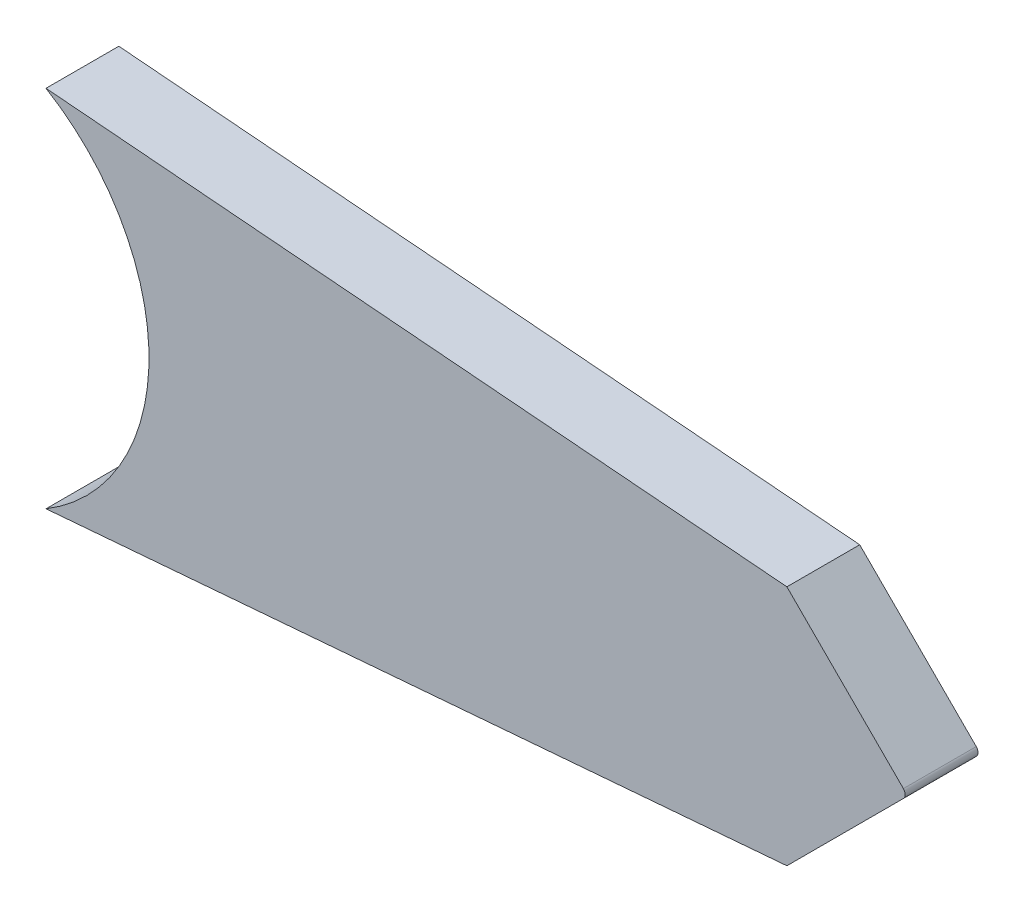
ISO-10303-21;
HEADER;
FILE_DESCRIPTION(('STEP AP214'),'2;1');
FILE_NAME('part.step','',(''),(''),'','','');
FILE_SCHEMA(('AUTOMOTIVE_DESIGN { 1 0 10303 214 1 1 1 1 }'));
ENDSEC;
DATA;
#1=APPLICATION_CONTEXT('core data for automotive mechanical design processes');
#2=APPLICATION_PROTOCOL_DEFINITION('international standard','automotive_design',2000,#1);
#3=PRODUCT_CONTEXT('',#1,'mechanical');
#4=PRODUCT('Part','Part','',(#3));
#5=PRODUCT_RELATED_PRODUCT_CATEGORY('part','',(#4));
#6=PRODUCT_DEFINITION_FORMATION('','',#4);
#7=PRODUCT_DEFINITION_CONTEXT('part definition',#1,'design');
#8=PRODUCT_DEFINITION('design','',#6,#7);
#9=PRODUCT_DEFINITION_SHAPE('','',#8);
#10=(LENGTH_UNIT() NAMED_UNIT(*) SI_UNIT(.MILLI.,.METRE.));
#11=(NAMED_UNIT(*) PLANE_ANGLE_UNIT() SI_UNIT($,.RADIAN.));
#12=(NAMED_UNIT(*) SI_UNIT($,.STERADIAN.) SOLID_ANGLE_UNIT());
#13=UNCERTAINTY_MEASURE_WITH_UNIT(LENGTH_MEASURE(1.E-05),#10,'distance_accuracy_value','');
#14=(GEOMETRIC_REPRESENTATION_CONTEXT(3) GLOBAL_UNCERTAINTY_ASSIGNED_CONTEXT((#13)) GLOBAL_UNIT_ASSIGNED_CONTEXT((#10,
#11,#12)) REPRESENTATION_CONTEXT('',''));
#15=CARTESIAN_POINT('',(0.,0.,0.));
#16=DIRECTION('',(0.,0.,1.));
#17=DIRECTION('',(1.,0.,0.));
#18=AXIS2_PLACEMENT_3D('',#15,#16,#17);
#19=CARTESIAN_POINT('',(-89.015,0.,6.));
#20=DIRECTION('',(0.,0.,-1.));
#21=DIRECTION('',(-1.,0.,0.));
#22=AXIS2_PLACEMENT_3D('',#19,#20,#21);
#23=CYLINDRICAL_SURFACE('',#22,35.);
#24=CARTESIAN_POINT('',(-89.015,0.,-6.));
#25=DIRECTION('',(0.,0.,-1.));
#26=DIRECTION('',(-1.,0.,0.));
#27=AXIS2_PLACEMENT_3D('',#24,#25,#26);
#28=CIRCLE('',#27,35.);
#29=CARTESIAN_POINT('',(-70.9872436226801,30.,-6.));
#30=VERTEX_POINT('',#29);
#31=CARTESIAN_POINT('',(-70.98724362268,-30.,-6.));
#32=VERTEX_POINT('',#31);
#33=EDGE_CURVE('E110',#30,#32,#28,.T.);
#34=ORIENTED_EDGE('',*,*,#33,.T.);
#35=DIRECTION('',(0.,0.,-1.));
#36=VECTOR('',#35,1.);
#37=CARTESIAN_POINT('',(-70.98724362268,-30.,6.));
#38=LINE('',#37,#36);
#39=CARTESIAN_POINT('',(-70.98724362268,-30.,6.));
#40=VERTEX_POINT('',#39);
#41=EDGE_CURVE('E92',#40,#32,#38,.T.);
#42=ORIENTED_EDGE('',*,*,#41,.F.);
#43=CARTESIAN_POINT('',(-89.015,0.,6.));
#44=DIRECTION('',(0.,0.,-1.));
#45=DIRECTION('',(-1.,0.,0.));
#46=AXIS2_PLACEMENT_3D('',#43,#44,#45);
#47=CIRCLE('',#46,35.);
#48=CARTESIAN_POINT('',(-70.9872436226801,30.,6.));
#49=VERTEX_POINT('',#48);
#50=EDGE_CURVE('E98',#49,#40,#47,.T.);
#51=ORIENTED_EDGE('',*,*,#50,.F.);
#52=DIRECTION('',(0.,0.,-1.));
#53=VECTOR('',#52,1.);
#54=CARTESIAN_POINT('',(-70.9872436226801,30.,6.));
#55=LINE('',#54,#53);
#56=EDGE_CURVE('E121',#49,#30,#55,.T.);
#57=ORIENTED_EDGE('',*,*,#56,.T.);
#58=EDGE_LOOP('',(#34,#42,#51,#57));
#59=FACE_BOUND('',#58,.T.);
#60=ADVANCED_FACE('F35',(#59),#23,.F.);
#61=CARTESIAN_POINT('',(51.0831537835289,-19.9018462164709,6.));
#62=DIRECTION('',(-0.0824424116507122,0.996595830194575,0.));
#63=DIRECTION('',(-0.996595830194575,-0.0824424116507122,0.));
#64=AXIS2_PLACEMENT_3D('',#61,#62,#63);
#65=PLANE('',#64);
#66=DIRECTION('',(0.996595830194575,0.0824424116507122,0.));
#67=VECTOR('',#66,1.);
#68=CARTESIAN_POINT('',(51.0831537835289,-19.9018462164709,-6.));
#69=LINE('',#68,#67);
#70=CARTESIAN_POINT('',(51.0831537835289,-19.9018462164709,-6.));
#71=VERTEX_POINT('',#70);
#72=EDGE_CURVE('E128',#32,#71,#69,.T.);
#73=ORIENTED_EDGE('',*,*,#72,.T.);
#74=DIRECTION('',(0.,0.,-1.));
#75=VECTOR('',#74,1.);
#76=CARTESIAN_POINT('',(51.0831537835289,-19.9018462164709,6.));
#77=LINE('',#76,#75);
#78=CARTESIAN_POINT('',(51.0831537835289,-19.9018462164709,6.));
#79=VERTEX_POINT('',#78);
#80=EDGE_CURVE('E95',#79,#71,#77,.T.);
#81=ORIENTED_EDGE('',*,*,#80,.F.);
#82=DIRECTION('',(0.996595830194575,0.0824424116507122,0.));
#83=VECTOR('',#82,1.);
#84=CARTESIAN_POINT('',(51.0831537835289,-19.9018462164709,6.));
#85=LINE('',#84,#83);
#86=EDGE_CURVE('E88',#40,#79,#85,.T.);
#87=ORIENTED_EDGE('',*,*,#86,.F.);
#88=ORIENTED_EDGE('',*,*,#41,.T.);
#89=EDGE_LOOP('',(#73,#81,#87,#88));
#90=FACE_BOUND('',#89,.T.);
#91=ADVANCED_FACE('F90',(#90),#65,.F.);
#92=CARTESIAN_POINT('',(70.985,1.44632569809566E-13,6.));
#93=DIRECTION('',(-0.707106781186547,0.707106781186548,0.));
#94=DIRECTION('',(-0.707106781186548,-0.707106781186547,0.));
#95=AXIS2_PLACEMENT_3D('',#92,#93,#94);
#96=PLANE('',#95);
#97=DIRECTION('',(0.707106781186548,0.707106781186547,0.));
#98=VECTOR('',#97,1.);
#99=CARTESIAN_POINT('',(70.985,1.44632569809566E-13,-6.));
#100=LINE('',#99,#98);
#101=CARTESIAN_POINT('',(70.2778932188134,-0.7071067811864,-6.));
#102=VERTEX_POINT('',#101);
#103=EDGE_CURVE('E126',#71,#102,#100,.T.);
#104=ORIENTED_EDGE('',*,*,#103,.T.);
#105=DIRECTION('',(0.,0.,-1.));
#106=VECTOR('',#105,1.);
#107=CARTESIAN_POINT('',(70.2778932188134,-0.7071067811864,6.));
#108=LINE('',#107,#106);
#109=CARTESIAN_POINT('',(70.2778932188134,-0.7071067811864,6.));
#110=VERTEX_POINT('',#109);
#111=EDGE_CURVE('E43',#102,#110,#108,.F.);
#112=ORIENTED_EDGE('',*,*,#111,.T.);
#113=DIRECTION('',(0.707106781186548,0.707106781186547,0.));
#114=VECTOR('',#113,1.);
#115=CARTESIAN_POINT('',(70.985,1.44632569809566E-13,6.));
#116=LINE('',#115,#114);
#117=EDGE_CURVE('E97',#79,#110,#116,.T.);
#118=ORIENTED_EDGE('',*,*,#117,.F.);
#119=ORIENTED_EDGE('',*,*,#80,.T.);
#120=EDGE_LOOP('',(#104,#112,#118,#119));
#121=FACE_BOUND('',#120,.T.);
#122=ADVANCED_FACE('F154',(#121),#96,.F.);
#123=CARTESIAN_POINT('',(51.0831537835289,19.9018462164712,6.));
#124=DIRECTION('',(-0.707106781186547,-0.707106781186548,0.));
#125=DIRECTION('',(0.707106781186548,-0.707106781186547,0.));
#126=AXIS2_PLACEMENT_3D('',#123,#124,#125);
#127=PLANE('',#126);
#128=DIRECTION('',(-0.707106781186548,0.707106781186547,0.));
#129=VECTOR('',#128,1.);
#130=CARTESIAN_POINT('',(51.0831537835289,19.9018462164712,6.));
#131=LINE('',#130,#129);
#132=CARTESIAN_POINT('',(70.2778932188134,0.707106781186691,6.));
#133=VERTEX_POINT('',#132);
#134=CARTESIAN_POINT('',(51.0831537835289,19.9018462164712,6.));
#135=VERTEX_POINT('',#134);
#136=EDGE_CURVE('E132',#133,#135,#131,.T.);
#137=ORIENTED_EDGE('',*,*,#136,.F.);
#138=DIRECTION('',(0.,0.,-1.));
#139=VECTOR('',#138,1.);
#140=CARTESIAN_POINT('',(70.2778932188134,0.707106781186694,6.));
#141=LINE('',#140,#139);
#142=CARTESIAN_POINT('',(70.2778932188134,0.707106781186691,-6.));
#143=VERTEX_POINT('',#142);
#144=EDGE_CURVE('E111',#133,#143,#141,.T.);
#145=ORIENTED_EDGE('',*,*,#144,.T.);
#146=DIRECTION('',(-0.707106781186548,0.707106781186547,0.));
#147=VECTOR('',#146,1.);
#148=CARTESIAN_POINT('',(51.0831537835289,19.9018462164712,-6.));
#149=LINE('',#148,#147);
#150=CARTESIAN_POINT('',(51.0831537835289,19.9018462164712,-6.));
#151=VERTEX_POINT('',#150);
#152=EDGE_CURVE('E124',#143,#151,#149,.T.);
#153=ORIENTED_EDGE('',*,*,#152,.T.);
#154=DIRECTION('',(0.,0.,-1.));
#155=VECTOR('',#154,1.);
#156=CARTESIAN_POINT('',(51.0831537835289,19.9018462164712,6.));
#157=LINE('',#156,#155);
#158=EDGE_CURVE('E115',#135,#151,#157,.T.);
#159=ORIENTED_EDGE('',*,*,#158,.F.);
#160=EDGE_LOOP('',(#137,#145,#153,#159));
#161=FACE_BOUND('',#160,.T.);
#162=ADVANCED_FACE('F139',(#161),#127,.F.);
#163=CARTESIAN_POINT('',(-70.9872436226801,30.,6.));
#164=DIRECTION('',(-0.0824424116507095,-0.996595830194575,0.));
#165=DIRECTION('',(0.996595830194576,-0.0824424116507095,0.));
#166=AXIS2_PLACEMENT_3D('',#163,#164,#165);
#167=PLANE('',#166);
#168=DIRECTION('',(-0.996595830194575,0.0824424116507095,0.));
#169=VECTOR('',#168,1.);
#170=CARTESIAN_POINT('',(-70.9872436226801,30.,-6.));
#171=LINE('',#170,#169);
#172=EDGE_CURVE('E107',#151,#30,#171,.T.);
#173=ORIENTED_EDGE('',*,*,#172,.T.);
#174=ORIENTED_EDGE('',*,*,#56,.F.);
#175=DIRECTION('',(-0.996595830194575,0.0824424116507095,0.));
#176=VECTOR('',#175,1.);
#177=CARTESIAN_POINT('',(-70.9872436226801,30.,6.));
#178=LINE('',#177,#176);
#179=EDGE_CURVE('E103',#135,#49,#178,.T.);
#180=ORIENTED_EDGE('',*,*,#179,.F.);
#181=ORIENTED_EDGE('',*,*,#158,.T.);
#182=EDGE_LOOP('',(#173,#174,#180,#181));
#183=FACE_BOUND('',#182,.T.);
#184=ADVANCED_FACE('F144',(#183),#167,.F.);
#185=CARTESIAN_POINT('',(-89.015,0.,6.));
#186=DIRECTION('',(0.,0.,-1.));
#187=DIRECTION('',(-1.,0.,0.));
#188=AXIS2_PLACEMENT_3D('',#185,#186,#187);
#189=PLANE('',#188);
#190=ORIENTED_EDGE('',*,*,#117,.T.);
#191=CARTESIAN_POINT('',(69.5707864376269,1.45716771982052E-13,6.));
#192=DIRECTION('',(0.,0.,-1.));
#193=DIRECTION('',(-1.,0.,0.));
#194=AXIS2_PLACEMENT_3D('',#191,#192,#193);
#195=CIRCLE('',#194,1.);
#196=EDGE_CURVE('E11',#110,#133,#195,.F.);
#197=ORIENTED_EDGE('',*,*,#196,.T.);
#198=ORIENTED_EDGE('',*,*,#136,.T.);
#199=ORIENTED_EDGE('',*,*,#179,.T.);
#200=ORIENTED_EDGE('',*,*,#50,.T.);
#201=ORIENTED_EDGE('',*,*,#86,.T.);
#202=EDGE_LOOP('',(#190,#197,#198,#199,#200,#201));
#203=FACE_BOUND('',#202,.T.);
#204=ADVANCED_FACE('F101',(#203),#189,.F.);
#205=CARTESIAN_POINT('',(-89.015,0.,-6.));
#206=DIRECTION('',(0.,0.,-1.));
#207=DIRECTION('',(-1.,0.,0.));
#208=AXIS2_PLACEMENT_3D('',#205,#206,#207);
#209=PLANE('',#208);
#210=ORIENTED_EDGE('',*,*,#152,.F.);
#211=CARTESIAN_POINT('',(69.5707864376269,1.45716771982052E-13,-6.));
#212=DIRECTION('',(0.,0.,-1.));
#213=DIRECTION('',(-1.,0.,0.));
#214=AXIS2_PLACEMENT_3D('',#211,#212,#213);
#215=CIRCLE('',#214,1.);
#216=EDGE_CURVE('E57',#143,#102,#215,.T.);
#217=ORIENTED_EDGE('',*,*,#216,.T.);
#218=ORIENTED_EDGE('',*,*,#103,.F.);
#219=ORIENTED_EDGE('',*,*,#72,.F.);
#220=ORIENTED_EDGE('',*,*,#33,.F.);
#221=ORIENTED_EDGE('',*,*,#172,.F.);
#222=EDGE_LOOP('',(#210,#217,#218,#219,#220,#221));
#223=FACE_BOUND('',#222,.T.);
#224=ADVANCED_FACE('F142',(#223),#209,.T.);
#225=CARTESIAN_POINT('',(69.5707864376269,1.45716771982052E-13,6.));
#226=DIRECTION('',(0.,0.,-1.));
#227=DIRECTION('',(-1.,0.,0.));
#228=AXIS2_PLACEMENT_3D('',#225,#226,#227);
#229=CYLINDRICAL_SURFACE('',#228,1.);
#230=ORIENTED_EDGE('',*,*,#196,.F.);
#231=ORIENTED_EDGE('',*,*,#111,.F.);
#232=ORIENTED_EDGE('',*,*,#216,.F.);
#233=ORIENTED_EDGE('',*,*,#144,.F.);
#234=EDGE_LOOP('',(#230,#231,#232,#233));
#235=FACE_BOUND('',#234,.T.);
#236=ADVANCED_FACE('F37',(#235),#229,.T.);
#237=CLOSED_SHELL('',(#60,#91,#122,#162,#184,#204,#224,#236));
#238=MANIFOLD_SOLID_BREP('B2',#237);
#239=ADVANCED_BREP_SHAPE_REPRESENTATION('',(#18,#238),#14);
#240=SHAPE_DEFINITION_REPRESENTATION(#9,#239);
ENDSEC;
END-ISO-10303-21;
